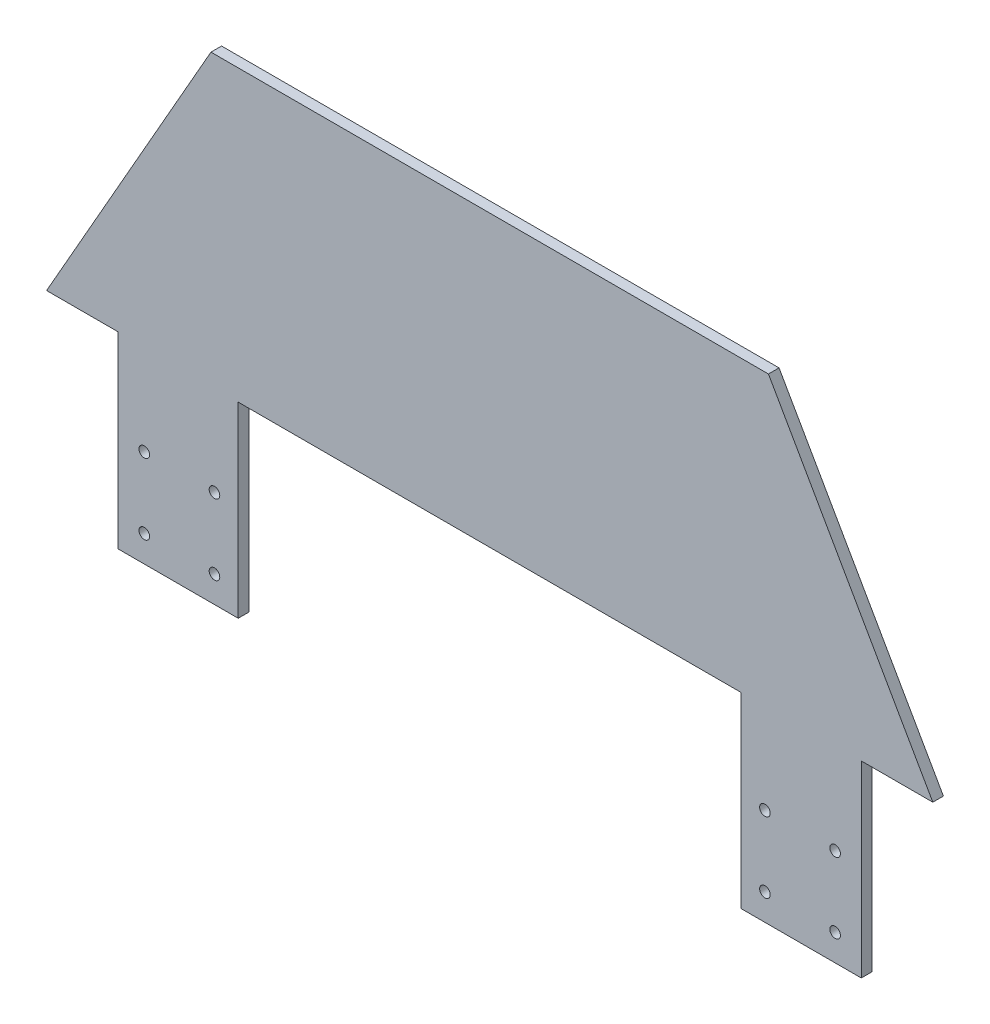
ISO-10303-21;
HEADER;
FILE_DESCRIPTION(('STEP AP214'),'2;1');
FILE_NAME('part.step','',(''),(''),'','','');
FILE_SCHEMA(('AUTOMOTIVE_DESIGN { 1 0 10303 214 1 1 1 1 }'));
ENDSEC;
DATA;
#1=APPLICATION_CONTEXT('core data for automotive mechanical design processes');
#2=APPLICATION_PROTOCOL_DEFINITION('international standard','automotive_design',2000,#1);
#3=PRODUCT_CONTEXT('',#1,'mechanical');
#4=PRODUCT('Part','Part','',(#3));
#5=PRODUCT_RELATED_PRODUCT_CATEGORY('part','',(#4));
#6=PRODUCT_DEFINITION_FORMATION('','',#4);
#7=PRODUCT_DEFINITION_CONTEXT('part definition',#1,'design');
#8=PRODUCT_DEFINITION('design','',#6,#7);
#9=PRODUCT_DEFINITION_SHAPE('','',#8);
#10=(LENGTH_UNIT() NAMED_UNIT(*) SI_UNIT(.MILLI.,.METRE.));
#11=(NAMED_UNIT(*) PLANE_ANGLE_UNIT() SI_UNIT($,.RADIAN.));
#12=(NAMED_UNIT(*) SI_UNIT($,.STERADIAN.) SOLID_ANGLE_UNIT());
#13=UNCERTAINTY_MEASURE_WITH_UNIT(LENGTH_MEASURE(1.E-05),#10,'distance_accuracy_value','');
#14=(GEOMETRIC_REPRESENTATION_CONTEXT(3) GLOBAL_UNCERTAINTY_ASSIGNED_CONTEXT((#13)) GLOBAL_UNIT_ASSIGNED_CONTEXT((#10,
#11,#12)) REPRESENTATION_CONTEXT('',''));
#15=CARTESIAN_POINT('',(0.,0.,0.));
#16=DIRECTION('',(0.,0.,1.));
#17=DIRECTION('',(1.,0.,0.));
#18=AXIS2_PLACEMENT_3D('',#15,#16,#17);
#19=CARTESIAN_POINT('',(-48.9531412279809,-88.1098869768863,0.));
#20=DIRECTION('',(1.,0.,0.));
#21=DIRECTION('',(0.,1.,0.));
#22=AXIS2_PLACEMENT_3D('',#19,#20,#21);
#23=PLANE('',#22);
#24=DIRECTION('',(0.,0.,1.));
#25=VECTOR('',#24,1.);
#26=CARTESIAN_POINT('',(-48.9531412279809,-34.8815164997052,0.));
#27=LINE('',#26,#25);
#28=CARTESIAN_POINT('',(-48.9531412279809,-34.8815164997052,0.));
#29=VERTEX_POINT('',#28);
#30=CARTESIAN_POINT('',(-48.9531412279809,-34.8815164997052,3.));
#31=VERTEX_POINT('',#30);
#32=EDGE_CURVE('E151',#29,#31,#27,.T.);
#33=ORIENTED_EDGE('',*,*,#32,.F.);
#34=DIRECTION('',(0.,1.,0.));
#35=VECTOR('',#34,1.);
#36=CARTESIAN_POINT('',(-48.9531412279809,-88.1098869768863,0.));
#37=LINE('',#36,#35);
#38=CARTESIAN_POINT('',(-48.9531412279809,-88.1098869768863,0.));
#39=VERTEX_POINT('',#38);
#40=EDGE_CURVE('E157',#39,#29,#37,.T.);
#41=ORIENTED_EDGE('',*,*,#40,.F.);
#42=DIRECTION('',(0.,0.,1.));
#43=VECTOR('',#42,1.);
#44=CARTESIAN_POINT('',(-48.9531412279809,-88.1098869768863,0.));
#45=LINE('',#44,#43);
#46=CARTESIAN_POINT('',(-48.9531412279809,-88.1098869768863,3.));
#47=VERTEX_POINT('',#46);
#48=EDGE_CURVE('E246',#39,#47,#45,.T.);
#49=ORIENTED_EDGE('',*,*,#48,.T.);
#50=DIRECTION('',(0.,1.,0.));
#51=VECTOR('',#50,1.);
#52=CARTESIAN_POINT('',(-48.9531412279809,-88.1098869768863,3.));
#53=LINE('',#52,#51);
#54=EDGE_CURVE('E262',#47,#31,#53,.T.);
#55=ORIENTED_EDGE('',*,*,#54,.T.);
#56=EDGE_LOOP('',(#33,#41,#49,#55));
#57=FACE_BOUND('',#56,.T.);
#58=ADVANCED_FACE('F45',(#57),#23,.F.);
#59=CARTESIAN_POINT('',(-161.446858772019,-88.1098869768863,3.));
#60=DIRECTION('',(0.,1.,0.));
#61=DIRECTION('',(0.,0.,1.));
#62=AXIS2_PLACEMENT_3D('',#59,#60,#61);
#63=PLANE('',#62);
#64=DIRECTION('',(1.,0.,0.));
#65=VECTOR('',#64,1.);
#66=CARTESIAN_POINT('',(-161.446858772019,-88.1098869768863,0.));
#67=LINE('',#66,#65);
#68=CARTESIAN_POINT('',(-14.9531412279809,-88.1098869768863,0.));
#69=VERTEX_POINT('',#68);
#70=EDGE_CURVE('E284',#39,#69,#67,.T.);
#71=ORIENTED_EDGE('',*,*,#70,.T.);
#72=DIRECTION('',(0.,0.,1.));
#73=VECTOR('',#72,1.);
#74=CARTESIAN_POINT('',(-14.9531412279809,-88.1098869768863,0.));
#75=LINE('',#74,#73);
#76=CARTESIAN_POINT('',(-14.9531412279809,-88.1098869768863,3.));
#77=VERTEX_POINT('',#76);
#78=EDGE_CURVE('E265',#69,#77,#75,.T.);
#79=ORIENTED_EDGE('',*,*,#78,.T.);
#80=DIRECTION('',(1.,0.,0.));
#81=VECTOR('',#80,1.);
#82=CARTESIAN_POINT('',(-161.446858772019,-88.1098869768863,3.));
#83=LINE('',#82,#81);
#84=EDGE_CURVE('E287',#47,#77,#83,.T.);
#85=ORIENTED_EDGE('',*,*,#84,.F.);
#86=ORIENTED_EDGE('',*,*,#48,.F.);
#87=EDGE_LOOP('',(#71,#79,#85,#86));
#88=FACE_BOUND('',#87,.T.);
#89=ADVANCED_FACE('F349',(#88),#63,.F.);
#90=CARTESIAN_POINT('',(161.446858772019,-88.1098869768863,3.));
#91=DIRECTION('',(-1.,0.,0.));
#92=DIRECTION('',(0.,0.,1.));
#93=AXIS2_PLACEMENT_3D('',#90,#91,#92);
#94=PLANE('',#93);
#95=DIRECTION('',(0.,1.,0.));
#96=VECTOR('',#95,1.);
#97=CARTESIAN_POINT('',(161.446858772019,-88.1098869768863,0.));
#98=LINE('',#97,#96);
#99=CARTESIAN_POINT('',(161.446858772019,-88.1098869768863,0.));
#100=VERTEX_POINT('',#99);
#101=CARTESIAN_POINT('',(161.446858772019,-34.8815164997052,0.));
#102=VERTEX_POINT('',#101);
#103=EDGE_CURVE('E269',#100,#102,#98,.T.);
#104=ORIENTED_EDGE('',*,*,#103,.T.);
#105=DIRECTION('',(0.,0.,1.));
#106=VECTOR('',#105,1.);
#107=CARTESIAN_POINT('',(161.446858772019,-34.8815164997052,0.));
#108=LINE('',#107,#106);
#109=CARTESIAN_POINT('',(161.446858772019,-34.8815164997052,3.));
#110=VERTEX_POINT('',#109);
#111=EDGE_CURVE('E164',#102,#110,#108,.T.);
#112=ORIENTED_EDGE('',*,*,#111,.T.);
#113=DIRECTION('',(0.,1.,0.));
#114=VECTOR('',#113,1.);
#115=CARTESIAN_POINT('',(161.446858772019,-88.1098869768863,3.));
#116=LINE('',#115,#114);
#117=CARTESIAN_POINT('',(161.446858772019,-88.1098869768863,3.));
#118=VERTEX_POINT('',#117);
#119=EDGE_CURVE('E279',#118,#110,#116,.T.);
#120=ORIENTED_EDGE('',*,*,#119,.F.);
#121=DIRECTION('',(0.,0.,-1.));
#122=VECTOR('',#121,1.);
#123=CARTESIAN_POINT('',(161.446858772019,-88.1098869768863,3.));
#124=LINE('',#123,#122);
#125=EDGE_CURVE('E294',#118,#100,#124,.T.);
#126=ORIENTED_EDGE('',*,*,#125,.T.);
#127=EDGE_LOOP('',(#104,#112,#120,#126));
#128=FACE_BOUND('',#127,.T.);
#129=ADVANCED_FACE('F47',(#128),#94,.F.);
#130=CARTESIAN_POINT('',(127.446858772019,-88.1098869768863,3.));
#131=VERTEX_POINT('',#130);
#132=EDGE_CURVE('E283',#131,#118,#83,.T.);
#133=ORIENTED_EDGE('',*,*,#132,.F.);
#134=DIRECTION('',(0.,0.,1.));
#135=VECTOR('',#134,1.);
#136=CARTESIAN_POINT('',(127.446858772019,-88.1098869768863,0.));
#137=LINE('',#136,#135);
#138=CARTESIAN_POINT('',(127.446858772019,-88.1098869768863,0.));
#139=VERTEX_POINT('',#138);
#140=EDGE_CURVE('E258',#139,#131,#137,.T.);
#141=ORIENTED_EDGE('',*,*,#140,.F.);
#142=EDGE_CURVE('E291',#139,#100,#67,.T.);
#143=ORIENTED_EDGE('',*,*,#142,.T.);
#144=ORIENTED_EDGE('',*,*,#125,.F.);
#145=EDGE_LOOP('',(#133,#141,#143,#144));
#146=FACE_BOUND('',#145,.T.);
#147=ADVANCED_FACE('F335',(#146),#63,.F.);
#148=CARTESIAN_POINT('',(0.,0.,3.));
#149=DIRECTION('',(0.,0.,-1.));
#150=DIRECTION('',(-1.,0.,0.));
#151=AXIS2_PLACEMENT_3D('',#148,#149,#150);
#152=PLANE('',#151);
#153=CARTESIAN_POINT('',(-21.6779829883322,-60.6098869768894,3.));
#154=DIRECTION('',(0.,0.,1.));
#155=DIRECTION('',(1.,0.,0.));
#156=AXIS2_PLACEMENT_3D('',#153,#154,#155);
#157=CIRCLE('',#156,1.5);
#158=CARTESIAN_POINT('',(-20.1779829883322,-60.6098869768894,3.));
#159=VERTEX_POINT('',#158);
#160=EDGE_CURVE('E203',#159,#159,#157,.T.);
#161=ORIENTED_EDGE('',*,*,#160,.F.);
#162=EDGE_LOOP('',(#161));
#163=FACE_BOUND('',#162,.T.);
#164=CARTESIAN_POINT('',(134.17170053237,-80.6098869768893,3.));
#165=DIRECTION('',(0.,0.,1.));
#166=DIRECTION('',(1.,0.,0.));
#167=AXIS2_PLACEMENT_3D('',#164,#165,#166);
#168=CIRCLE('',#167,1.5);
#169=CARTESIAN_POINT('',(135.67170053237,-80.6098869768893,3.));
#170=VERTEX_POINT('',#169);
#171=EDGE_CURVE('E194',#170,#170,#168,.T.);
#172=ORIENTED_EDGE('',*,*,#171,.F.);
#173=EDGE_LOOP('',(#172));
#174=FACE_BOUND('',#173,.T.);
#175=CARTESIAN_POINT('',(134.17170053237,-60.6098869768893,3.));
#176=DIRECTION('',(0.,0.,1.));
#177=DIRECTION('',(1.,0.,0.));
#178=AXIS2_PLACEMENT_3D('',#175,#176,#177);
#179=CIRCLE('',#178,1.5);
#180=CARTESIAN_POINT('',(135.67170053237,-60.6098869768893,3.));
#181=VERTEX_POINT('',#180);
#182=EDGE_CURVE('E219',#181,#181,#179,.T.);
#183=ORIENTED_EDGE('',*,*,#182,.F.);
#184=EDGE_LOOP('',(#183));
#185=FACE_BOUND('',#184,.T.);
#186=CARTESIAN_POINT('',(154.040490146812,-80.6098869768894,3.));
#187=DIRECTION('',(0.,0.,1.));
#188=DIRECTION('',(1.,0.,0.));
#189=AXIS2_PLACEMENT_3D('',#186,#187,#188);
#190=CIRCLE('',#189,1.5);
#191=CARTESIAN_POINT('',(155.540490146812,-80.6098869768894,3.));
#192=VERTEX_POINT('',#191);
#193=EDGE_CURVE('E210',#192,#192,#190,.T.);
#194=ORIENTED_EDGE('',*,*,#193,.F.);
#195=EDGE_LOOP('',(#194));
#196=FACE_BOUND('',#195,.T.);
#197=CARTESIAN_POINT('',(-41.5467726027741,-80.6098869768894,3.));
#198=DIRECTION('',(0.,0.,1.));
#199=DIRECTION('',(1.,0.,0.));
#200=AXIS2_PLACEMENT_3D('',#197,#198,#199);
#201=CIRCLE('',#200,1.5);
#202=CARTESIAN_POINT('',(-40.0467726027741,-80.6098869768894,3.));
#203=VERTEX_POINT('',#202);
#204=EDGE_CURVE('E170',#203,#203,#201,.T.);
#205=ORIENTED_EDGE('',*,*,#204,.F.);
#206=EDGE_LOOP('',(#205));
#207=FACE_BOUND('',#206,.T.);
#208=CARTESIAN_POINT('',(-41.5467726027741,-60.6098869768893,3.));
#209=DIRECTION('',(0.,0.,1.));
#210=DIRECTION('',(1.,0.,0.));
#211=AXIS2_PLACEMENT_3D('',#208,#209,#210);
#212=CIRCLE('',#211,1.5);
#213=CARTESIAN_POINT('',(-40.0467726027741,-60.6098869768893,3.));
#214=VERTEX_POINT('',#213);
#215=EDGE_CURVE('E187',#214,#214,#212,.T.);
#216=ORIENTED_EDGE('',*,*,#215,.F.);
#217=EDGE_LOOP('',(#216));
#218=FACE_BOUND('',#217,.T.);
#219=CARTESIAN_POINT('',(-21.6779829883322,-80.6098869768894,3.));
#220=DIRECTION('',(0.,0.,1.));
#221=DIRECTION('',(1.,0.,0.));
#222=AXIS2_PLACEMENT_3D('',#219,#220,#221);
#223=CIRCLE('',#222,1.5);
#224=CARTESIAN_POINT('',(-20.1779829883322,-80.6098869768894,3.));
#225=VERTEX_POINT('',#224);
#226=EDGE_CURVE('E178',#225,#225,#223,.T.);
#227=ORIENTED_EDGE('',*,*,#226,.F.);
#228=EDGE_LOOP('',(#227));
#229=FACE_BOUND('',#228,.T.);
#230=CARTESIAN_POINT('',(154.040490146812,-60.6098869768893,3.));
#231=DIRECTION('',(0.,0.,1.));
#232=DIRECTION('',(1.,0.,0.));
#233=AXIS2_PLACEMENT_3D('',#230,#231,#232);
#234=CIRCLE('',#233,1.5);
#235=CARTESIAN_POINT('',(155.540490146812,-60.6098869768893,3.));
#236=VERTEX_POINT('',#235);
#237=EDGE_CURVE('E214',#236,#236,#234,.T.);
#238=ORIENTED_EDGE('',*,*,#237,.F.);
#239=EDGE_LOOP('',(#238));
#240=FACE_BOUND('',#239,.T.);
#241=DIRECTION('',(1.,0.,0.));
#242=VECTOR('',#241,1.);
#243=CARTESIAN_POINT('',(138.622177289421,46.8474620874644,3.));
#244=LINE('',#243,#242);
#245=CARTESIAN_POINT('',(-22.6704034735352,46.8474620874644,3.));
#246=VERTEX_POINT('',#245);
#247=CARTESIAN_POINT('',(135.163373814812,46.8474620874644,3.));
#248=VERTEX_POINT('',#247);
#249=EDGE_CURVE('E141',#246,#248,#244,.T.);
#250=ORIENTED_EDGE('',*,*,#249,.F.);
#251=DIRECTION('',(0.494808555412233,0.86900201006146,0.));
#252=VECTOR('',#251,1.);
#253=CARTESIAN_POINT('',(-69.2067720455418,-34.8815164997052,3.));
#254=LINE('',#253,#252);
#255=CARTESIAN_POINT('',(-69.2067720455418,-34.8815164997052,3.));
#256=VERTEX_POINT('',#255);
#257=EDGE_CURVE('E69',#256,#246,#254,.T.);
#258=ORIENTED_EDGE('',*,*,#257,.F.);
#259=DIRECTION('',(1.,0.,0.));
#260=VECTOR('',#259,1.);
#261=CARTESIAN_POINT('',(0.,-34.8815164997052,3.));
#262=LINE('',#261,#260);
#263=EDGE_CURVE('E149',#256,#31,#262,.T.);
#264=ORIENTED_EDGE('',*,*,#263,.T.);
#265=ORIENTED_EDGE('',*,*,#54,.F.);
#266=ORIENTED_EDGE('',*,*,#84,.T.);
#267=DIRECTION('',(0.,-1.,0.));
#268=VECTOR('',#267,1.);
#269=CARTESIAN_POINT('',(-14.9531412279808,-53.1098869768893,3.));
#270=LINE('',#269,#268);
#271=CARTESIAN_POINT('',(-14.9531412279808,-35.1098869768893,3.));
#272=VERTEX_POINT('',#271);
#273=EDGE_CURVE('E254',#272,#77,#270,.T.);
#274=ORIENTED_EDGE('',*,*,#273,.F.);
#275=DIRECTION('',(-1.,0.,0.));
#276=VECTOR('',#275,1.);
#277=CARTESIAN_POINT('',(-14.9531412279808,-35.1098869768893,3.));
#278=LINE('',#277,#276);
#279=CARTESIAN_POINT('',(127.446858772019,-35.1098869768893,3.));
#280=VERTEX_POINT('',#279);
#281=EDGE_CURVE('E230',#280,#272,#278,.T.);
#282=ORIENTED_EDGE('',*,*,#281,.F.);
#283=DIRECTION('',(0.,1.,0.));
#284=VECTOR('',#283,1.);
#285=CARTESIAN_POINT('',(127.446858772019,-88.1098869768863,3.));
#286=LINE('',#285,#284);
#287=EDGE_CURVE('E259',#131,#280,#286,.T.);
#288=ORIENTED_EDGE('',*,*,#287,.F.);
#289=ORIENTED_EDGE('',*,*,#132,.T.);
#290=ORIENTED_EDGE('',*,*,#119,.T.);
#291=DIRECTION('',(-1.,0.,0.));
#292=VECTOR('',#291,1.);
#293=CARTESIAN_POINT('',(0.,-34.8815164997052,3.));
#294=LINE('',#293,#292);
#295=CARTESIAN_POINT('',(181.70048958958,-34.8815164997052,3.));
#296=VERTEX_POINT('',#295);
#297=EDGE_CURVE('E306',#296,#110,#294,.T.);
#298=ORIENTED_EDGE('',*,*,#297,.F.);
#299=DIRECTION('',(0.494814555010615,-0.868998593870926,0.));
#300=VECTOR('',#299,1.);
#301=CARTESIAN_POINT('',(181.70048958958,-34.8815164997052,3.));
#302=LINE('',#301,#300);
#303=EDGE_CURVE('E572',#248,#296,#302,.T.);
#304=ORIENTED_EDGE('',*,*,#303,.F.);
#305=EDGE_LOOP('',(#250,#258,#264,#265,#266,#274,#282,#288,#289,#290,#298,#304));
#306=FACE_BOUND('',#305,.T.);
#307=ADVANCED_FACE('F328',(#163,#174,#185,#196,#207,#218,#229,#240,#306),#152,.F.);
#308=CARTESIAN_POINT('',(0.,0.,0.));
#309=DIRECTION('',(0.,0.,-1.));
#310=DIRECTION('',(-1.,0.,0.));
#311=AXIS2_PLACEMENT_3D('',#308,#309,#310);
#312=PLANE('',#311);
#313=DIRECTION('',(0.494808555412233,0.86900201006146,0.));
#314=VECTOR('',#313,1.);
#315=CARTESIAN_POINT('',(-69.2067720455418,-34.8815164997052,0.));
#316=LINE('',#315,#314);
#317=CARTESIAN_POINT('',(-69.2067720455418,-34.8815164997052,0.));
#318=VERTEX_POINT('',#317);
#319=CARTESIAN_POINT('',(-22.6704034735352,46.8474620874644,0.));
#320=VERTEX_POINT('',#319);
#321=EDGE_CURVE('E132',#318,#320,#316,.T.);
#322=ORIENTED_EDGE('',*,*,#321,.T.);
#323=DIRECTION('',(1.,0.,0.));
#324=VECTOR('',#323,1.);
#325=CARTESIAN_POINT('',(138.622177289421,46.8474620874644,0.));
#326=LINE('',#325,#324);
#327=CARTESIAN_POINT('',(135.163373814812,46.8474620874644,0.));
#328=VERTEX_POINT('',#327);
#329=EDGE_CURVE('E301',#320,#328,#326,.T.);
#330=ORIENTED_EDGE('',*,*,#329,.T.);
#331=DIRECTION('',(0.494814555010615,-0.868998593870926,0.));
#332=VECTOR('',#331,1.);
#333=CARTESIAN_POINT('',(181.70048958958,-34.8815164997052,0.));
#334=LINE('',#333,#332);
#335=CARTESIAN_POINT('',(181.70048958958,-34.8815164997052,0.));
#336=VERTEX_POINT('',#335);
#337=EDGE_CURVE('E61',#328,#336,#334,.T.);
#338=ORIENTED_EDGE('',*,*,#337,.T.);
#339=DIRECTION('',(-1.,0.,0.));
#340=VECTOR('',#339,1.);
#341=CARTESIAN_POINT('',(0.,-34.8815164997052,0.));
#342=LINE('',#341,#340);
#343=EDGE_CURVE('E310',#336,#102,#342,.T.);
#344=ORIENTED_EDGE('',*,*,#343,.T.);
#345=ORIENTED_EDGE('',*,*,#103,.F.);
#346=ORIENTED_EDGE('',*,*,#142,.F.);
#347=DIRECTION('',(0.,1.,0.));
#348=VECTOR('',#347,1.);
#349=CARTESIAN_POINT('',(127.446858772019,-88.1098869768863,0.));
#350=LINE('',#349,#348);
#351=CARTESIAN_POINT('',(127.446858772019,-35.1098869768893,0.));
#352=VERTEX_POINT('',#351);
#353=EDGE_CURVE('E250',#139,#352,#350,.T.);
#354=ORIENTED_EDGE('',*,*,#353,.T.);
#355=DIRECTION('',(-1.,0.,0.));
#356=VECTOR('',#355,1.);
#357=CARTESIAN_POINT('',(-14.9531412279808,-35.1098869768893,0.));
#358=LINE('',#357,#356);
#359=CARTESIAN_POINT('',(-14.9531412279808,-35.1098869768893,0.));
#360=VERTEX_POINT('',#359);
#361=EDGE_CURVE('E234',#352,#360,#358,.T.);
#362=ORIENTED_EDGE('',*,*,#361,.T.);
#363=DIRECTION('',(0.,-1.,0.));
#364=VECTOR('',#363,1.);
#365=CARTESIAN_POINT('',(-14.9531412279808,-53.1098869768893,0.));
#366=LINE('',#365,#364);
#367=EDGE_CURVE('E253',#360,#69,#366,.T.);
#368=ORIENTED_EDGE('',*,*,#367,.T.);
#369=ORIENTED_EDGE('',*,*,#70,.F.);
#370=ORIENTED_EDGE('',*,*,#40,.T.);
#371=DIRECTION('',(1.,0.,0.));
#372=VECTOR('',#371,1.);
#373=CARTESIAN_POINT('',(0.,-34.8815164997052,0.));
#374=LINE('',#373,#372);
#375=EDGE_CURVE('E146',#318,#29,#374,.T.);
#376=ORIENTED_EDGE('',*,*,#375,.F.);
#377=EDGE_LOOP('',(#322,#330,#338,#344,#345,#346,#354,#362,#368,#369,#370,#376));
#378=FACE_BOUND('',#377,.T.);
#379=CARTESIAN_POINT('',(-21.6779829883322,-60.6098869768894,0.));
#380=DIRECTION('',(0.,0.,1.));
#381=DIRECTION('',(1.,0.,0.));
#382=AXIS2_PLACEMENT_3D('',#379,#380,#381);
#383=CIRCLE('',#382,1.5);
#384=CARTESIAN_POINT('',(-20.1779829883322,-60.6098869768894,0.));
#385=VERTEX_POINT('',#384);
#386=EDGE_CURVE('E182',#385,#385,#383,.T.);
#387=ORIENTED_EDGE('',*,*,#386,.T.);
#388=EDGE_LOOP('',(#387));
#389=FACE_BOUND('',#388,.T.);
#390=CARTESIAN_POINT('',(134.17170053237,-80.6098869768893,0.));
#391=DIRECTION('',(0.,0.,1.));
#392=DIRECTION('',(1.,0.,0.));
#393=AXIS2_PLACEMENT_3D('',#390,#391,#392);
#394=CIRCLE('',#393,1.5);
#395=CARTESIAN_POINT('',(135.67170053237,-80.6098869768893,0.));
#396=VERTEX_POINT('',#395);
#397=EDGE_CURVE('E199',#396,#396,#394,.T.);
#398=ORIENTED_EDGE('',*,*,#397,.T.);
#399=EDGE_LOOP('',(#398));
#400=FACE_BOUND('',#399,.T.);
#401=CARTESIAN_POINT('',(134.17170053237,-60.6098869768893,0.));
#402=DIRECTION('',(0.,0.,1.));
#403=DIRECTION('',(1.,0.,0.));
#404=AXIS2_PLACEMENT_3D('',#401,#402,#403);
#405=CIRCLE('',#404,1.5);
#406=CARTESIAN_POINT('',(135.67170053237,-60.6098869768893,0.));
#407=VERTEX_POINT('',#406);
#408=EDGE_CURVE('E198',#407,#407,#405,.T.);
#409=ORIENTED_EDGE('',*,*,#408,.T.);
#410=EDGE_LOOP('',(#409));
#411=FACE_BOUND('',#410,.T.);
#412=CARTESIAN_POINT('',(154.040490146812,-80.6098869768894,0.));
#413=DIRECTION('',(0.,0.,1.));
#414=DIRECTION('',(1.,0.,0.));
#415=AXIS2_PLACEMENT_3D('',#412,#413,#414);
#416=CIRCLE('',#415,1.5);
#417=CARTESIAN_POINT('',(155.540490146812,-80.6098869768894,0.));
#418=VERTEX_POINT('',#417);
#419=EDGE_CURVE('E215',#418,#418,#416,.T.);
#420=ORIENTED_EDGE('',*,*,#419,.T.);
#421=EDGE_LOOP('',(#420));
#422=FACE_BOUND('',#421,.T.);
#423=CARTESIAN_POINT('',(-41.5467726027741,-80.6098869768894,0.));
#424=DIRECTION('',(0.,0.,1.));
#425=DIRECTION('',(1.,0.,0.));
#426=AXIS2_PLACEMENT_3D('',#423,#424,#425);
#427=CIRCLE('',#426,1.5);
#428=CARTESIAN_POINT('',(-40.0467726027741,-80.6098869768894,0.));
#429=VERTEX_POINT('',#428);
#430=EDGE_CURVE('E168',#429,#429,#427,.T.);
#431=ORIENTED_EDGE('',*,*,#430,.T.);
#432=EDGE_LOOP('',(#431));
#433=FACE_BOUND('',#432,.T.);
#434=CARTESIAN_POINT('',(-41.5467726027741,-60.6098869768893,0.));
#435=DIRECTION('',(0.,0.,1.));
#436=DIRECTION('',(1.,0.,0.));
#437=AXIS2_PLACEMENT_3D('',#434,#435,#436);
#438=CIRCLE('',#437,1.5);
#439=CARTESIAN_POINT('',(-40.0467726027741,-60.6098869768893,0.));
#440=VERTEX_POINT('',#439);
#441=EDGE_CURVE('E174',#440,#440,#438,.T.);
#442=ORIENTED_EDGE('',*,*,#441,.T.);
#443=EDGE_LOOP('',(#442));
#444=FACE_BOUND('',#443,.T.);
#445=CARTESIAN_POINT('',(-21.6779829883322,-80.6098869768894,0.));
#446=DIRECTION('',(0.,0.,1.));
#447=DIRECTION('',(1.,0.,0.));
#448=AXIS2_PLACEMENT_3D('',#445,#446,#447);
#449=CIRCLE('',#448,1.5);
#450=CARTESIAN_POINT('',(-20.1779829883322,-80.6098869768894,0.));
#451=VERTEX_POINT('',#450);
#452=EDGE_CURVE('E183',#451,#451,#449,.T.);
#453=ORIENTED_EDGE('',*,*,#452,.T.);
#454=EDGE_LOOP('',(#453));
#455=FACE_BOUND('',#454,.T.);
#456=CARTESIAN_POINT('',(154.040490146812,-60.6098869768893,0.));
#457=DIRECTION('',(0.,0.,1.));
#458=DIRECTION('',(1.,0.,0.));
#459=AXIS2_PLACEMENT_3D('',#456,#457,#458);
#460=CIRCLE('',#459,1.5);
#461=CARTESIAN_POINT('',(155.540490146812,-60.6098869768893,0.));
#462=VERTEX_POINT('',#461);
#463=EDGE_CURVE('E226',#462,#462,#460,.T.);
#464=ORIENTED_EDGE('',*,*,#463,.T.);
#465=EDGE_LOOP('',(#464));
#466=FACE_BOUND('',#465,.T.);
#467=ADVANCED_FACE('F154',(#378,#389,#400,#411,#422,#433,#444,#455,#466),#312,.T.);
#468=CARTESIAN_POINT('',(-14.9531412279808,-53.1098869768893,0.));
#469=DIRECTION('',(-1.,0.,0.));
#470=DIRECTION('',(0.,-1.,0.));
#471=AXIS2_PLACEMENT_3D('',#468,#469,#470);
#472=PLANE('',#471);
#473=ORIENTED_EDGE('',*,*,#273,.T.);
#474=ORIENTED_EDGE('',*,*,#78,.F.);
#475=ORIENTED_EDGE('',*,*,#367,.F.);
#476=DIRECTION('',(0.,0.,1.));
#477=VECTOR('',#476,1.);
#478=CARTESIAN_POINT('',(-14.9531412279808,-35.1098869768893,0.));
#479=LINE('',#478,#477);
#480=EDGE_CURVE('E242',#360,#272,#479,.T.);
#481=ORIENTED_EDGE('',*,*,#480,.T.);
#482=EDGE_LOOP('',(#473,#474,#475,#481));
#483=FACE_BOUND('',#482,.T.);
#484=ADVANCED_FACE('F364',(#483),#472,.F.);
#485=CARTESIAN_POINT('',(127.446858772019,-88.1098869768863,0.));
#486=DIRECTION('',(1.,0.,0.));
#487=DIRECTION('',(0.,1.,0.));
#488=AXIS2_PLACEMENT_3D('',#485,#486,#487);
#489=PLANE('',#488);
#490=ORIENTED_EDGE('',*,*,#287,.T.);
#491=DIRECTION('',(0.,0.,1.));
#492=VECTOR('',#491,1.);
#493=CARTESIAN_POINT('',(127.446858772019,-35.1098869768893,0.));
#494=LINE('',#493,#492);
#495=EDGE_CURVE('E238',#352,#280,#494,.T.);
#496=ORIENTED_EDGE('',*,*,#495,.F.);
#497=ORIENTED_EDGE('',*,*,#353,.F.);
#498=ORIENTED_EDGE('',*,*,#140,.T.);
#499=EDGE_LOOP('',(#490,#496,#497,#498));
#500=FACE_BOUND('',#499,.T.);
#501=ADVANCED_FACE('F358',(#500),#489,.F.);
#502=CARTESIAN_POINT('',(-14.9531412279808,-35.1098869768893,0.));
#503=DIRECTION('',(0.,1.,0.));
#504=DIRECTION('',(0.,0.,1.));
#505=AXIS2_PLACEMENT_3D('',#502,#503,#504);
#506=PLANE('',#505);
#507=ORIENTED_EDGE('',*,*,#281,.T.);
#508=ORIENTED_EDGE('',*,*,#480,.F.);
#509=ORIENTED_EDGE('',*,*,#361,.F.);
#510=ORIENTED_EDGE('',*,*,#495,.T.);
#511=EDGE_LOOP('',(#507,#508,#509,#510));
#512=FACE_BOUND('',#511,.T.);
#513=ADVANCED_FACE('F403',(#512),#506,.F.);
#514=CARTESIAN_POINT('',(154.040490146812,-60.6098869768893,0.));
#515=DIRECTION('',(0.,0.,1.));
#516=DIRECTION('',(1.,0.,0.));
#517=AXIS2_PLACEMENT_3D('',#514,#515,#516);
#518=CYLINDRICAL_SURFACE('',#517,1.5);
#519=ORIENTED_EDGE('',*,*,#463,.F.);
#520=EDGE_LOOP('',(#519));
#521=FACE_BOUND('',#520,.T.);
#522=ORIENTED_EDGE('',*,*,#237,.T.);
#523=EDGE_LOOP('',(#522));
#524=FACE_BOUND('',#523,.T.);
#525=ADVANCED_FACE('F412',(#521,#524),#518,.F.);
#526=CARTESIAN_POINT('',(-21.6779829883322,-80.6098869768894,0.));
#527=DIRECTION('',(0.,0.,1.));
#528=DIRECTION('',(1.,0.,0.));
#529=AXIS2_PLACEMENT_3D('',#526,#527,#528);
#530=CYLINDRICAL_SURFACE('',#529,1.5);
#531=ORIENTED_EDGE('',*,*,#452,.F.);
#532=EDGE_LOOP('',(#531));
#533=FACE_BOUND('',#532,.T.);
#534=ORIENTED_EDGE('',*,*,#226,.T.);
#535=EDGE_LOOP('',(#534));
#536=FACE_BOUND('',#535,.T.);
#537=ADVANCED_FACE('F423',(#533,#536),#530,.F.);
#538=CARTESIAN_POINT('',(-41.5467726027741,-60.6098869768893,0.));
#539=DIRECTION('',(0.,0.,1.));
#540=DIRECTION('',(1.,0.,0.));
#541=AXIS2_PLACEMENT_3D('',#538,#539,#540);
#542=CYLINDRICAL_SURFACE('',#541,1.5);
#543=ORIENTED_EDGE('',*,*,#441,.F.);
#544=EDGE_LOOP('',(#543));
#545=FACE_BOUND('',#544,.T.);
#546=ORIENTED_EDGE('',*,*,#215,.T.);
#547=EDGE_LOOP('',(#546));
#548=FACE_BOUND('',#547,.T.);
#549=ADVANCED_FACE('F434',(#545,#548),#542,.F.);
#550=CARTESIAN_POINT('',(-41.5467726027741,-80.6098869768894,0.));
#551=DIRECTION('',(0.,0.,1.));
#552=DIRECTION('',(1.,0.,0.));
#553=AXIS2_PLACEMENT_3D('',#550,#551,#552);
#554=CYLINDRICAL_SURFACE('',#553,1.5);
#555=ORIENTED_EDGE('',*,*,#430,.F.);
#556=EDGE_LOOP('',(#555));
#557=FACE_BOUND('',#556,.T.);
#558=ORIENTED_EDGE('',*,*,#204,.T.);
#559=EDGE_LOOP('',(#558));
#560=FACE_BOUND('',#559,.T.);
#561=ADVANCED_FACE('F445',(#557,#560),#554,.F.);
#562=CARTESIAN_POINT('',(154.040490146812,-80.6098869768894,0.));
#563=DIRECTION('',(0.,0.,1.));
#564=DIRECTION('',(1.,0.,0.));
#565=AXIS2_PLACEMENT_3D('',#562,#563,#564);
#566=CYLINDRICAL_SURFACE('',#565,1.5);
#567=ORIENTED_EDGE('',*,*,#419,.F.);
#568=EDGE_LOOP('',(#567));
#569=FACE_BOUND('',#568,.T.);
#570=ORIENTED_EDGE('',*,*,#193,.T.);
#571=EDGE_LOOP('',(#570));
#572=FACE_BOUND('',#571,.T.);
#573=ADVANCED_FACE('F456',(#569,#572),#566,.F.);
#574=CARTESIAN_POINT('',(134.17170053237,-60.6098869768893,0.));
#575=DIRECTION('',(0.,0.,1.));
#576=DIRECTION('',(1.,0.,0.));
#577=AXIS2_PLACEMENT_3D('',#574,#575,#576);
#578=CYLINDRICAL_SURFACE('',#577,1.5);
#579=ORIENTED_EDGE('',*,*,#408,.F.);
#580=EDGE_LOOP('',(#579));
#581=FACE_BOUND('',#580,.T.);
#582=ORIENTED_EDGE('',*,*,#182,.T.);
#583=EDGE_LOOP('',(#582));
#584=FACE_BOUND('',#583,.T.);
#585=ADVANCED_FACE('F467',(#581,#584),#578,.F.);
#586=CARTESIAN_POINT('',(134.17170053237,-80.6098869768893,0.));
#587=DIRECTION('',(0.,0.,1.));
#588=DIRECTION('',(1.,0.,0.));
#589=AXIS2_PLACEMENT_3D('',#586,#587,#588);
#590=CYLINDRICAL_SURFACE('',#589,1.5);
#591=ORIENTED_EDGE('',*,*,#397,.F.);
#592=EDGE_LOOP('',(#591));
#593=FACE_BOUND('',#592,.T.);
#594=ORIENTED_EDGE('',*,*,#171,.T.);
#595=EDGE_LOOP('',(#594));
#596=FACE_BOUND('',#595,.T.);
#597=ADVANCED_FACE('F478',(#593,#596),#590,.F.);
#598=CARTESIAN_POINT('',(-21.6779829883322,-60.6098869768894,0.));
#599=DIRECTION('',(0.,0.,1.));
#600=DIRECTION('',(1.,0.,0.));
#601=AXIS2_PLACEMENT_3D('',#598,#599,#600);
#602=CYLINDRICAL_SURFACE('',#601,1.5);
#603=ORIENTED_EDGE('',*,*,#386,.F.);
#604=EDGE_LOOP('',(#603));
#605=FACE_BOUND('',#604,.T.);
#606=ORIENTED_EDGE('',*,*,#160,.T.);
#607=EDGE_LOOP('',(#606));
#608=FACE_BOUND('',#607,.T.);
#609=ADVANCED_FACE('F346',(#605,#608),#602,.F.);
#610=CARTESIAN_POINT('',(0.,-34.8815164997052,0.));
#611=DIRECTION('',(0.,-1.,0.));
#612=DIRECTION('',(0.,0.,-1.));
#613=AXIS2_PLACEMENT_3D('',#610,#611,#612);
#614=PLANE('',#613);
#615=ORIENTED_EDGE('',*,*,#263,.F.);
#616=DIRECTION('',(0.,0.,1.));
#617=VECTOR('',#616,1.);
#618=CARTESIAN_POINT('',(-69.2067720455418,-34.8815164997052,0.));
#619=LINE('',#618,#617);
#620=EDGE_CURVE('E135',#318,#256,#619,.T.);
#621=ORIENTED_EDGE('',*,*,#620,.F.);
#622=ORIENTED_EDGE('',*,*,#375,.T.);
#623=ORIENTED_EDGE('',*,*,#32,.T.);
#624=EDGE_LOOP('',(#615,#621,#622,#623));
#625=FACE_BOUND('',#624,.T.);
#626=ADVANCED_FACE('F145',(#625),#614,.T.);
#627=CARTESIAN_POINT('',(0.,-34.8815164997052,0.));
#628=DIRECTION('',(0.,1.,0.));
#629=DIRECTION('',(0.,0.,1.));
#630=AXIS2_PLACEMENT_3D('',#627,#628,#629);
#631=PLANE('',#630);
#632=ORIENTED_EDGE('',*,*,#297,.T.);
#633=ORIENTED_EDGE('',*,*,#111,.F.);
#634=ORIENTED_EDGE('',*,*,#343,.F.);
#635=DIRECTION('',(0.,0.,1.));
#636=VECTOR('',#635,1.);
#637=CARTESIAN_POINT('',(181.70048958958,-34.8815164997052,0.));
#638=LINE('',#637,#636);
#639=EDGE_CURVE('E161',#336,#296,#638,.T.);
#640=ORIENTED_EDGE('',*,*,#639,.T.);
#641=EDGE_LOOP('',(#632,#633,#634,#640));
#642=FACE_BOUND('',#641,.T.);
#643=ADVANCED_FACE('F337',(#642),#631,.F.);
#644=CARTESIAN_POINT('',(138.622177289421,46.8474620874644,0.));
#645=DIRECTION('',(0.,-1.,0.));
#646=DIRECTION('',(0.,0.,-1.));
#647=AXIS2_PLACEMENT_3D('',#644,#645,#646);
#648=PLANE('',#647);
#649=ORIENTED_EDGE('',*,*,#329,.F.);
#650=DIRECTION('',(0.,0.,1.));
#651=VECTOR('',#650,1.);
#652=CARTESIAN_POINT('',(-22.6704034735352,46.8474620874644,0.));
#653=LINE('',#652,#651);
#654=EDGE_CURVE('E11',#320,#246,#653,.T.);
#655=ORIENTED_EDGE('',*,*,#654,.T.);
#656=ORIENTED_EDGE('',*,*,#249,.T.);
#657=DIRECTION('',(0.,0.,-1.));
#658=VECTOR('',#657,1.);
#659=CARTESIAN_POINT('',(135.163373814812,46.8474620874644,0.));
#660=LINE('',#659,#658);
#661=EDGE_CURVE('E54',#248,#328,#660,.T.);
#662=ORIENTED_EDGE('',*,*,#661,.T.);
#663=EDGE_LOOP('',(#649,#655,#656,#662));
#664=FACE_BOUND('',#663,.T.);
#665=ADVANCED_FACE('F300',(#664),#648,.F.);
#666=CARTESIAN_POINT('',(181.70048958958,-34.8815164997052,0.));
#667=DIRECTION('',(-0.868998593870926,-0.494814555010615,0.));
#668=DIRECTION('',(0.494814555010615,-0.868998593870926,0.));
#669=AXIS2_PLACEMENT_3D('',#666,#667,#668);
#670=PLANE('',#669);
#671=ORIENTED_EDGE('',*,*,#303,.T.);
#672=ORIENTED_EDGE('',*,*,#639,.F.);
#673=ORIENTED_EDGE('',*,*,#337,.F.);
#674=ORIENTED_EDGE('',*,*,#661,.F.);
#675=EDGE_LOOP('',(#671,#672,#673,#674));
#676=FACE_BOUND('',#675,.T.);
#677=ADVANCED_FACE('F344',(#676),#670,.F.);
#678=CARTESIAN_POINT('',(-69.2067720455418,-34.8815164997052,0.));
#679=DIRECTION('',(0.86900201006146,-0.494808555412234,0.));
#680=DIRECTION('',(0.494808555412234,0.869002010061461,0.));
#681=AXIS2_PLACEMENT_3D('',#678,#679,#680);
#682=PLANE('',#681);
#683=ORIENTED_EDGE('',*,*,#321,.F.);
#684=ORIENTED_EDGE('',*,*,#620,.T.);
#685=ORIENTED_EDGE('',*,*,#257,.T.);
#686=ORIENTED_EDGE('',*,*,#654,.F.);
#687=EDGE_LOOP('',(#683,#684,#685,#686));
#688=FACE_BOUND('',#687,.T.);
#689=ADVANCED_FACE('F134',(#688),#682,.F.);
#690=CLOSED_SHELL('',(#58,#89,#129,#147,#307,#467,#484,#501,#513,#525,#537,#549,#561,#573,#585,
#597,#609,#626,#643,#665,#677,#689));
#691=MANIFOLD_SOLID_BREP('B2',#690);
#692=ADVANCED_BREP_SHAPE_REPRESENTATION('',(#18,#691),#14);
#693=SHAPE_DEFINITION_REPRESENTATION(#9,#692);
ENDSEC;
END-ISO-10303-21;
